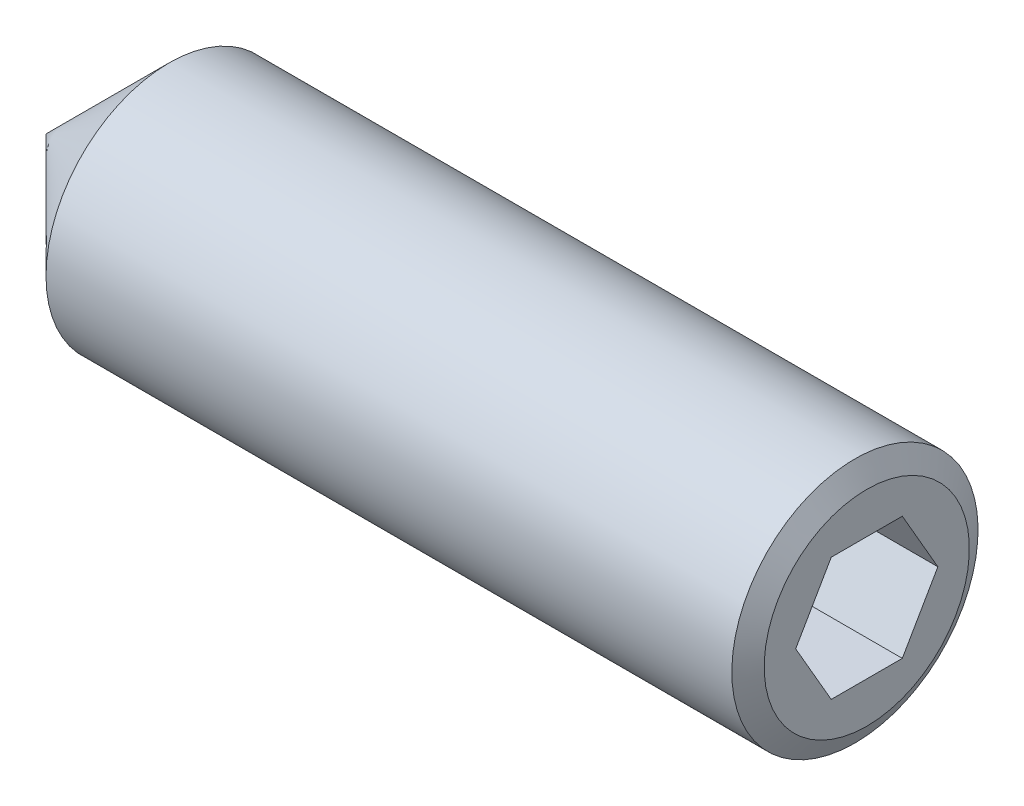
ISO-10303-21;
HEADER;
FILE_DESCRIPTION(('STEP AP214'),'2;1');
FILE_NAME('part.step','',(''),(''),'','','');
FILE_SCHEMA(('AUTOMOTIVE_DESIGN { 1 0 10303 214 1 1 1 1 }'));
ENDSEC;
DATA;
#1=APPLICATION_CONTEXT('core data for automotive mechanical design processes');
#2=APPLICATION_PROTOCOL_DEFINITION('international standard','automotive_design',2000,#1);
#3=PRODUCT_CONTEXT('',#1,'mechanical');
#4=PRODUCT('Part','Part','',(#3));
#5=PRODUCT_RELATED_PRODUCT_CATEGORY('part','',(#4));
#6=PRODUCT_DEFINITION_FORMATION('','',#4);
#7=PRODUCT_DEFINITION_CONTEXT('part definition',#1,'design');
#8=PRODUCT_DEFINITION('design','',#6,#7);
#9=PRODUCT_DEFINITION_SHAPE('','',#8);
#10=(LENGTH_UNIT() NAMED_UNIT(*) SI_UNIT(.MILLI.,.METRE.));
#11=(NAMED_UNIT(*) PLANE_ANGLE_UNIT() SI_UNIT($,.RADIAN.));
#12=(NAMED_UNIT(*) SI_UNIT($,.STERADIAN.) SOLID_ANGLE_UNIT());
#13=UNCERTAINTY_MEASURE_WITH_UNIT(LENGTH_MEASURE(1.E-05),#10,'distance_accuracy_value','');
#14=(GEOMETRIC_REPRESENTATION_CONTEXT(3) GLOBAL_UNCERTAINTY_ASSIGNED_CONTEXT((#13)) GLOBAL_UNIT_ASSIGNED_CONTEXT((#10,
#11,#12)) REPRESENTATION_CONTEXT('',''));
#15=CARTESIAN_POINT('',(0.,0.,0.));
#16=DIRECTION('',(0.,0.,1.));
#17=DIRECTION('',(1.,0.,0.));
#18=AXIS2_PLACEMENT_3D('',#15,#16,#17);
#19=CARTESIAN_POINT('',(20.,3.,0.));
#20=DIRECTION('',(-1.,0.,0.));
#21=DIRECTION('',(0.,-1.,0.));
#22=AXIS2_PLACEMENT_3D('',#19,#20,#21);
#23=PLANE('',#22);
#24=CARTESIAN_POINT('',(20.,0.,0.));
#25=DIRECTION('',(-1.,0.,0.));
#26=DIRECTION('',(0.,-1.,0.));
#27=AXIS2_PLACEMENT_3D('',#24,#25,#26);
#28=CIRCLE('',#27,2.5);
#29=CARTESIAN_POINT('',(20.,-2.5,0.));
#30=VERTEX_POINT('',#29);
#31=EDGE_CURVE('E11',#30,#30,#28,.F.);
#32=ORIENTED_EDGE('',*,*,#31,.T.);
#33=EDGE_LOOP('',(#32));
#34=FACE_BOUND('',#33,.T.);
#35=DIRECTION('',(0.,0.866025403784438,0.5));
#36=VECTOR('',#35,1.);
#37=CARTESIAN_POINT('',(20.,0.,-1.73205080756888));
#38=LINE('',#37,#36);
#39=CARTESIAN_POINT('',(20.,0.,-1.73205080756888));
#40=VERTEX_POINT('',#39);
#41=CARTESIAN_POINT('',(20.,1.5,-0.866025403784438));
#42=VERTEX_POINT('',#41);
#43=EDGE_CURVE('E124',#40,#42,#38,.T.);
#44=ORIENTED_EDGE('',*,*,#43,.F.);
#45=DIRECTION('',(0.,0.866025403784439,-0.5));
#46=VECTOR('',#45,1.);
#47=CARTESIAN_POINT('',(20.,-1.5,-0.866025403784439));
#48=LINE('',#47,#46);
#49=CARTESIAN_POINT('',(20.,-1.5,-0.866025403784439));
#50=VERTEX_POINT('',#49);
#51=EDGE_CURVE('E51',#50,#40,#48,.T.);
#52=ORIENTED_EDGE('',*,*,#51,.F.);
#53=DIRECTION('',(0.,0.,-1.));
#54=VECTOR('',#53,1.);
#55=CARTESIAN_POINT('',(20.,-1.5,0.866025403784438));
#56=LINE('',#55,#54);
#57=CARTESIAN_POINT('',(20.,-1.5,0.866025403784438));
#58=VERTEX_POINT('',#57);
#59=EDGE_CURVE('E110',#58,#50,#56,.T.);
#60=ORIENTED_EDGE('',*,*,#59,.F.);
#61=DIRECTION('',(0.,-0.866025403784439,-0.5));
#62=VECTOR('',#61,1.);
#63=CARTESIAN_POINT('',(20.,0.,1.73205080756888));
#64=LINE('',#63,#62);
#65=CARTESIAN_POINT('',(20.,0.,1.73205080756888));
#66=VERTEX_POINT('',#65);
#67=EDGE_CURVE('E113',#66,#58,#64,.T.);
#68=ORIENTED_EDGE('',*,*,#67,.F.);
#69=DIRECTION('',(0.,-0.866025403784439,0.5));
#70=VECTOR('',#69,1.);
#71=CARTESIAN_POINT('',(20.,1.5,0.866025403784439));
#72=LINE('',#71,#70);
#73=CARTESIAN_POINT('',(20.,1.5,0.866025403784439));
#74=VERTEX_POINT('',#73);
#75=EDGE_CURVE('E129',#74,#66,#72,.T.);
#76=ORIENTED_EDGE('',*,*,#75,.F.);
#77=DIRECTION('',(0.,0.,1.));
#78=VECTOR('',#77,1.);
#79=CARTESIAN_POINT('',(20.,1.5,-0.866025403784438));
#80=LINE('',#79,#78);
#81=EDGE_CURVE('E126',#42,#74,#80,.T.);
#82=ORIENTED_EDGE('',*,*,#81,.F.);
#83=EDGE_LOOP('',(#44,#52,#60,#68,#76,#82));
#84=FACE_BOUND('',#83,.T.);
#85=ADVANCED_FACE('F36',(#34,#84),#23,.F.);
#86=CARTESIAN_POINT('',(0.,0.,0.));
#87=DIRECTION('',(-1.,0.,0.));
#88=DIRECTION('',(0.,-1.,0.));
#89=AXIS2_PLACEMENT_3D('',#86,#87,#88);
#90=CYLINDRICAL_SURFACE('',#89,3.);
#91=CARTESIAN_POINT('',(19.7113248654052,0.,0.));
#92=DIRECTION('',(-1.,0.,0.));
#93=DIRECTION('',(0.,-1.,0.));
#94=AXIS2_PLACEMENT_3D('',#91,#92,#93);
#95=CIRCLE('',#94,3.);
#96=CARTESIAN_POINT('',(19.7113248654052,-3.,0.));
#97=VERTEX_POINT('',#96);
#98=EDGE_CURVE('E44',#97,#97,#95,.T.);
#99=ORIENTED_EDGE('',*,*,#98,.T.);
#100=EDGE_LOOP('',(#99));
#101=FACE_BOUND('',#100,.T.);
#102=CARTESIAN_POINT('',(2.99999999999999,0.,0.));
#103=DIRECTION('',(-1.,0.,0.));
#104=DIRECTION('',(0.,-1.,0.));
#105=AXIS2_PLACEMENT_3D('',#102,#103,#104);
#106=CIRCLE('',#105,3.);
#107=CARTESIAN_POINT('',(2.99999999999999,-3.,0.));
#108=VERTEX_POINT('',#107);
#109=EDGE_CURVE('E136',#108,#108,#106,.T.);
#110=ORIENTED_EDGE('',*,*,#109,.F.);
#111=EDGE_LOOP('',(#110));
#112=FACE_BOUND('',#111,.T.);
#113=ADVANCED_FACE('F148',(#101,#112),#90,.T.);
#114=CARTESIAN_POINT('',(2.99999999999999,0.,0.));
#115=DIRECTION('',(1.,0.,0.));
#116=DIRECTION('',(0.,1.,0.));
#117=AXIS2_PLACEMENT_3D('',#114,#115,#116);
#118=CONICAL_SURFACE('',#117,3.,0.78539816339745);
#119=CARTESIAN_POINT('',(0.,0.,0.));
#120=VERTEX_POINT('',#119);
#121=VERTEX_LOOP('',#120);
#122=FACE_BOUND('',#121,.T.);
#123=ORIENTED_EDGE('',*,*,#109,.T.);
#124=EDGE_LOOP('',(#123));
#125=FACE_BOUND('',#124,.T.);
#126=ADVANCED_FACE('F163',(#122,#125),#118,.T.);
#127=CARTESIAN_POINT('',(16.5,-1.5,-0.866025403784439));
#128=DIRECTION('',(0.,-0.5,-0.866025403784439));
#129=DIRECTION('',(0.,0.866025403784439,-0.5));
#130=AXIS2_PLACEMENT_3D('',#127,#128,#129);
#131=PLANE('',#130);
#132=ORIENTED_EDGE('',*,*,#51,.T.);
#133=DIRECTION('',(1.,0.,0.));
#134=VECTOR('',#133,1.);
#135=CARTESIAN_POINT('',(16.5,0.,-1.73205080756888));
#136=LINE('',#135,#134);
#137=CARTESIAN_POINT('',(16.5,0.,-1.73205080756888));
#138=VERTEX_POINT('',#137);
#139=EDGE_CURVE('E87',#138,#40,#136,.T.);
#140=ORIENTED_EDGE('',*,*,#139,.F.);
#141=DIRECTION('',(0.,0.866025403784439,-0.5));
#142=VECTOR('',#141,1.);
#143=CARTESIAN_POINT('',(16.5,-1.5,-0.866025403784439));
#144=LINE('',#143,#142);
#145=CARTESIAN_POINT('',(16.5,-1.5,-0.866025403784439));
#146=VERTEX_POINT('',#145);
#147=EDGE_CURVE('E91',#146,#138,#144,.T.);
#148=ORIENTED_EDGE('',*,*,#147,.F.);
#149=DIRECTION('',(1.,0.,0.));
#150=VECTOR('',#149,1.);
#151=CARTESIAN_POINT('',(16.5,-1.5,-0.866025403784439));
#152=LINE('',#151,#150);
#153=EDGE_CURVE('E134',#146,#50,#152,.T.);
#154=ORIENTED_EDGE('',*,*,#153,.T.);
#155=EDGE_LOOP('',(#132,#140,#148,#154));
#156=FACE_BOUND('',#155,.T.);
#157=ADVANCED_FACE('F89',(#156),#131,.F.);
#158=CARTESIAN_POINT('',(16.5,-1.5,0.866025403784438));
#159=DIRECTION('',(0.,-1.,0.));
#160=DIRECTION('',(1.,0.,0.));
#161=AXIS2_PLACEMENT_3D('',#158,#159,#160);
#162=PLANE('',#161);
#163=ORIENTED_EDGE('',*,*,#59,.T.);
#164=ORIENTED_EDGE('',*,*,#153,.F.);
#165=DIRECTION('',(0.,0.,-1.));
#166=VECTOR('',#165,1.);
#167=CARTESIAN_POINT('',(16.5,-1.5,0.866025403784438));
#168=LINE('',#167,#166);
#169=CARTESIAN_POINT('',(16.5,-1.5,0.866025403784438));
#170=VERTEX_POINT('',#169);
#171=EDGE_CURVE('E97',#170,#146,#168,.T.);
#172=ORIENTED_EDGE('',*,*,#171,.F.);
#173=DIRECTION('',(1.,0.,0.));
#174=VECTOR('',#173,1.);
#175=CARTESIAN_POINT('',(16.5,-1.5,0.866025403784438));
#176=LINE('',#175,#174);
#177=EDGE_CURVE('E137',#170,#58,#176,.T.);
#178=ORIENTED_EDGE('',*,*,#177,.T.);
#179=EDGE_LOOP('',(#163,#164,#172,#178));
#180=FACE_BOUND('',#179,.T.);
#181=ADVANCED_FACE('F171',(#180),#162,.F.);
#182=CARTESIAN_POINT('',(16.5,0.,1.73205080756888));
#183=DIRECTION('',(0.,-0.5,0.866025403784439));
#184=DIRECTION('',(0.,-0.866025403784439,-0.5));
#185=AXIS2_PLACEMENT_3D('',#182,#183,#184);
#186=PLANE('',#185);
#187=ORIENTED_EDGE('',*,*,#67,.T.);
#188=ORIENTED_EDGE('',*,*,#177,.F.);
#189=DIRECTION('',(0.,-0.866025403784439,-0.5));
#190=VECTOR('',#189,1.);
#191=CARTESIAN_POINT('',(16.5,0.,1.73205080756888));
#192=LINE('',#191,#190);
#193=CARTESIAN_POINT('',(16.5,0.,1.73205080756888));
#194=VERTEX_POINT('',#193);
#195=EDGE_CURVE('E120',#194,#170,#192,.T.);
#196=ORIENTED_EDGE('',*,*,#195,.F.);
#197=DIRECTION('',(1.,0.,0.));
#198=VECTOR('',#197,1.);
#199=CARTESIAN_POINT('',(16.5,0.,1.73205080756888));
#200=LINE('',#199,#198);
#201=EDGE_CURVE('E139',#194,#66,#200,.T.);
#202=ORIENTED_EDGE('',*,*,#201,.T.);
#203=EDGE_LOOP('',(#187,#188,#196,#202));
#204=FACE_BOUND('',#203,.T.);
#205=ADVANCED_FACE('F181',(#204),#186,.F.);
#206=CARTESIAN_POINT('',(16.5,1.5,0.866025403784439));
#207=DIRECTION('',(0.,0.5,0.866025403784439));
#208=DIRECTION('',(0.,-0.866025403784439,0.5));
#209=AXIS2_PLACEMENT_3D('',#206,#207,#208);
#210=PLANE('',#209);
#211=ORIENTED_EDGE('',*,*,#75,.T.);
#212=ORIENTED_EDGE('',*,*,#201,.F.);
#213=DIRECTION('',(0.,-0.866025403784439,0.5));
#214=VECTOR('',#213,1.);
#215=CARTESIAN_POINT('',(16.5,1.5,0.866025403784439));
#216=LINE('',#215,#214);
#217=CARTESIAN_POINT('',(16.5,1.5,0.866025403784439));
#218=VERTEX_POINT('',#217);
#219=EDGE_CURVE('E117',#218,#194,#216,.T.);
#220=ORIENTED_EDGE('',*,*,#219,.F.);
#221=DIRECTION('',(1.,0.,0.));
#222=VECTOR('',#221,1.);
#223=CARTESIAN_POINT('',(16.5,1.5,0.866025403784439));
#224=LINE('',#223,#222);
#225=EDGE_CURVE('E141',#218,#74,#224,.T.);
#226=ORIENTED_EDGE('',*,*,#225,.T.);
#227=EDGE_LOOP('',(#211,#212,#220,#226));
#228=FACE_BOUND('',#227,.T.);
#229=ADVANCED_FACE('F177',(#228),#210,.F.);
#230=CARTESIAN_POINT('',(16.5,1.5,-0.866025403784438));
#231=DIRECTION('',(0.,1.,0.));
#232=DIRECTION('',(0.,0.,1.));
#233=AXIS2_PLACEMENT_3D('',#230,#231,#232);
#234=PLANE('',#233);
#235=ORIENTED_EDGE('',*,*,#81,.T.);
#236=ORIENTED_EDGE('',*,*,#225,.F.);
#237=DIRECTION('',(0.,0.,1.));
#238=VECTOR('',#237,1.);
#239=CARTESIAN_POINT('',(16.5,1.5,-0.866025403784438));
#240=LINE('',#239,#238);
#241=CARTESIAN_POINT('',(16.5,1.5,-0.866025403784438));
#242=VERTEX_POINT('',#241);
#243=EDGE_CURVE('E105',#242,#218,#240,.T.);
#244=ORIENTED_EDGE('',*,*,#243,.F.);
#245=DIRECTION('',(1.,0.,0.));
#246=VECTOR('',#245,1.);
#247=CARTESIAN_POINT('',(16.5,1.5,-0.866025403784438));
#248=LINE('',#247,#246);
#249=EDGE_CURVE('E96',#242,#42,#248,.T.);
#250=ORIENTED_EDGE('',*,*,#249,.T.);
#251=EDGE_LOOP('',(#235,#236,#244,#250));
#252=FACE_BOUND('',#251,.T.);
#253=ADVANCED_FACE('F174',(#252),#234,.F.);
#254=CARTESIAN_POINT('',(16.5,0.,-1.73205080756888));
#255=DIRECTION('',(0.,0.5,-0.866025403784438));
#256=DIRECTION('',(0.,0.866025403784439,0.5));
#257=AXIS2_PLACEMENT_3D('',#254,#255,#256);
#258=PLANE('',#257);
#259=ORIENTED_EDGE('',*,*,#43,.T.);
#260=ORIENTED_EDGE('',*,*,#249,.F.);
#261=DIRECTION('',(0.,0.866025403784438,0.5));
#262=VECTOR('',#261,1.);
#263=CARTESIAN_POINT('',(16.5,0.,-1.73205080756888));
#264=LINE('',#263,#262);
#265=EDGE_CURVE('E100',#138,#242,#264,.T.);
#266=ORIENTED_EDGE('',*,*,#265,.F.);
#267=ORIENTED_EDGE('',*,*,#139,.T.);
#268=EDGE_LOOP('',(#259,#260,#266,#267));
#269=FACE_BOUND('',#268,.T.);
#270=ADVANCED_FACE('F101',(#269),#258,.F.);
#271=CARTESIAN_POINT('',(16.5,-1.5,-0.866025403784439));
#272=DIRECTION('',(-1.,0.,0.));
#273=DIRECTION('',(0.,0.,1.));
#274=AXIS2_PLACEMENT_3D('',#271,#272,#273);
#275=PLANE('',#274);
#276=ORIENTED_EDGE('',*,*,#147,.T.);
#277=ORIENTED_EDGE('',*,*,#265,.T.);
#278=ORIENTED_EDGE('',*,*,#243,.T.);
#279=ORIENTED_EDGE('',*,*,#219,.T.);
#280=ORIENTED_EDGE('',*,*,#195,.T.);
#281=ORIENTED_EDGE('',*,*,#171,.T.);
#282=EDGE_LOOP('',(#276,#277,#278,#279,#280,#281));
#283=FACE_BOUND('',#282,.T.);
#284=ADVANCED_FACE('F107',(#283),#275,.F.);
#285=CARTESIAN_POINT('',(19.7113248654052,0.,0.));
#286=DIRECTION('',(-1.,0.,0.));
#287=DIRECTION('',(0.,-1.,0.));
#288=AXIS2_PLACEMENT_3D('',#285,#286,#287);
#289=CONICAL_SURFACE('',#288,3.,1.0471975511966);
#290=ORIENTED_EDGE('',*,*,#31,.F.);
#291=EDGE_LOOP('',(#290));
#292=FACE_BOUND('',#291,.T.);
#293=ORIENTED_EDGE('',*,*,#98,.F.);
#294=EDGE_LOOP('',(#293));
#295=FACE_BOUND('',#294,.T.);
#296=ADVANCED_FACE('F38',(#292,#295),#289,.T.);
#297=CLOSED_SHELL('',(#85,#113,#126,#157,#181,#205,#229,#253,#270,#284,#296));
#298=MANIFOLD_SOLID_BREP('B2',#297);
#299=ADVANCED_BREP_SHAPE_REPRESENTATION('',(#18,#298),#14);
#300=SHAPE_DEFINITION_REPRESENTATION(#9,#299);
ENDSEC;
END-ISO-10303-21;
